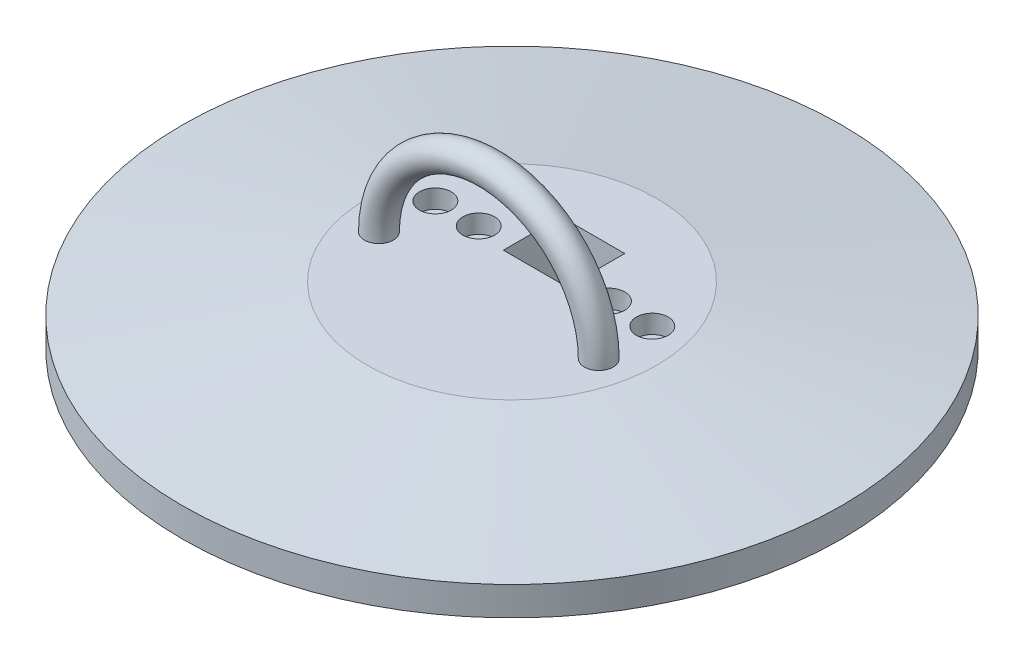
ISO-10303-21;
HEADER;
FILE_DESCRIPTION(('STEP AP214'),'2;1');
FILE_NAME('part.step','',(''),(''),'','','');
FILE_SCHEMA(('AUTOMOTIVE_DESIGN { 1 0 10303 214 1 1 1 1 }'));
ENDSEC;
DATA;
#1=APPLICATION_CONTEXT('core data for automotive mechanical design processes');
#2=APPLICATION_PROTOCOL_DEFINITION('international standard','automotive_design',2000,#1);
#3=PRODUCT_CONTEXT('',#1,'mechanical');
#4=PRODUCT('Part','Part','',(#3));
#5=PRODUCT_RELATED_PRODUCT_CATEGORY('part','',(#4));
#6=PRODUCT_DEFINITION_FORMATION('','',#4);
#7=PRODUCT_DEFINITION_CONTEXT('part definition',#1,'design');
#8=PRODUCT_DEFINITION('design','',#6,#7);
#9=PRODUCT_DEFINITION_SHAPE('','',#8);
#10=(LENGTH_UNIT() NAMED_UNIT(*) SI_UNIT(.MILLI.,.METRE.));
#11=(NAMED_UNIT(*) PLANE_ANGLE_UNIT() SI_UNIT($,.RADIAN.));
#12=(NAMED_UNIT(*) SI_UNIT($,.STERADIAN.) SOLID_ANGLE_UNIT());
#13=UNCERTAINTY_MEASURE_WITH_UNIT(LENGTH_MEASURE(1.E-05),#10,'distance_accuracy_value','');
#14=(GEOMETRIC_REPRESENTATION_CONTEXT(3) GLOBAL_UNCERTAINTY_ASSIGNED_CONTEXT((#13)) GLOBAL_UNIT_ASSIGNED_CONTEXT((#10,
#11,#12)) REPRESENTATION_CONTEXT('',''));
#15=CARTESIAN_POINT('',(0.,0.,0.));
#16=DIRECTION('',(0.,0.,1.));
#17=DIRECTION('',(1.,0.,0.));
#18=AXIS2_PLACEMENT_3D('',#15,#16,#17);
#19=CARTESIAN_POINT('',(0.,20.,0.));
#20=DIRECTION('',(0.,1.,0.));
#21=DIRECTION('',(0.,0.,1.));
#22=AXIS2_PLACEMENT_3D('',#19,#20,#21);
#23=PLANE('',#22);
#24=CARTESIAN_POINT('',(38.,20.,8.));
#25=DIRECTION('',(0.,1.,0.));
#26=DIRECTION('',(0.,0.,1.));
#27=AXIS2_PLACEMENT_3D('',#24,#25,#26);
#28=CIRCLE('',#27,5.);
#29=CARTESIAN_POINT('',(43.,20.,8.));
#30=VERTEX_POINT('',#29);
#31=EDGE_CURVE('E12',#30,#30,#28,.T.);
#32=ORIENTED_EDGE('',*,*,#31,.F.);
#33=EDGE_LOOP('',(#32));
#34=FACE_BOUND('',#33,.T.);
#35=CARTESIAN_POINT('',(37.5,20.,-11.));
#36=DIRECTION('',(0.,1.,0.));
#37=DIRECTION('',(0.,0.,1.));
#38=AXIS2_PLACEMENT_3D('',#35,#36,#37);
#39=CIRCLE('',#38,5.5);
#40=CARTESIAN_POINT('',(37.5,20.,-5.5));
#41=VERTEX_POINT('',#40);
#42=EDGE_CURVE('E150',#41,#41,#39,.T.);
#43=ORIENTED_EDGE('',*,*,#42,.F.);
#44=EDGE_LOOP('',(#43));
#45=FACE_BOUND('',#44,.T.);
#46=CARTESIAN_POINT('',(22.5,20.,-11.));
#47=DIRECTION('',(0.,1.,0.));
#48=DIRECTION('',(0.,0.,1.));
#49=AXIS2_PLACEMENT_3D('',#46,#47,#48);
#50=CIRCLE('',#49,5.5);
#51=CARTESIAN_POINT('',(22.5,20.,-5.5));
#52=VERTEX_POINT('',#51);
#53=EDGE_CURVE('E165',#52,#52,#50,.T.);
#54=ORIENTED_EDGE('',*,*,#53,.F.);
#55=EDGE_LOOP('',(#54));
#56=FACE_BOUND('',#55,.T.);
#57=CARTESIAN_POINT('',(-22.5,20.,-11.));
#58=DIRECTION('',(0.,1.,0.));
#59=DIRECTION('',(0.,0.,1.));
#60=AXIS2_PLACEMENT_3D('',#57,#58,#59);
#61=CIRCLE('',#60,5.5);
#62=CARTESIAN_POINT('',(-22.5,20.,-5.5));
#63=VERTEX_POINT('',#62);
#64=EDGE_CURVE('E177',#63,#63,#61,.T.);
#65=ORIENTED_EDGE('',*,*,#64,.F.);
#66=EDGE_LOOP('',(#65));
#67=FACE_BOUND('',#66,.T.);
#68=CARTESIAN_POINT('',(-37.5,20.,-11.));
#69=DIRECTION('',(0.,1.,0.));
#70=DIRECTION('',(0.,0.,1.));
#71=AXIS2_PLACEMENT_3D('',#68,#69,#70);
#72=CIRCLE('',#71,5.5);
#73=CARTESIAN_POINT('',(-37.5,20.,-5.5));
#74=VERTEX_POINT('',#73);
#75=EDGE_CURVE('E189',#74,#74,#72,.T.);
#76=ORIENTED_EDGE('',*,*,#75,.F.);
#77=EDGE_LOOP('',(#76));
#78=FACE_BOUND('',#77,.T.);
#79=DIRECTION('',(0.,0.,1.));
#80=VECTOR('',#79,1.);
#81=CARTESIAN_POINT('',(-11.,20.,-8.));
#82=LINE('',#81,#80);
#83=CARTESIAN_POINT('',(-11.,20.,-28.));
#84=VERTEX_POINT('',#83);
#85=CARTESIAN_POINT('',(-11.,20.,-8.));
#86=VERTEX_POINT('',#85);
#87=EDGE_CURVE('E201',#84,#86,#82,.T.);
#88=ORIENTED_EDGE('',*,*,#87,.F.);
#89=DIRECTION('',(-1.,0.,0.));
#90=VECTOR('',#89,1.);
#91=CARTESIAN_POINT('',(11.,20.,-28.));
#92=LINE('',#91,#90);
#93=CARTESIAN_POINT('',(11.,20.,-28.));
#94=VERTEX_POINT('',#93);
#95=EDGE_CURVE('E206',#94,#84,#92,.T.);
#96=ORIENTED_EDGE('',*,*,#95,.F.);
#97=DIRECTION('',(0.,0.,-1.));
#98=VECTOR('',#97,1.);
#99=CARTESIAN_POINT('',(11.,20.,-8.));
#100=LINE('',#99,#98);
#101=CARTESIAN_POINT('',(11.,20.,-8.));
#102=VERTEX_POINT('',#101);
#103=EDGE_CURVE('E219',#102,#94,#100,.T.);
#104=ORIENTED_EDGE('',*,*,#103,.F.);
#105=DIRECTION('',(1.,0.,0.));
#106=VECTOR('',#105,1.);
#107=CARTESIAN_POINT('',(11.,20.,-8.));
#108=LINE('',#107,#106);
#109=EDGE_CURVE('E216',#86,#102,#108,.T.);
#110=ORIENTED_EDGE('',*,*,#109,.F.);
#111=EDGE_LOOP('',(#88,#96,#104,#110));
#112=FACE_BOUND('',#111,.T.);
#113=CARTESIAN_POINT('',(0.,20.,0.));
#114=DIRECTION('',(0.,-1.,0.));
#115=DIRECTION('',(0.,0.,-1.));
#116=AXIS2_PLACEMENT_3D('',#113,#114,#115);
#117=CIRCLE('',#116,50.);
#118=CARTESIAN_POINT('',(0.,20.,-50.));
#119=VERTEX_POINT('',#118);
#120=EDGE_CURVE('E120',#119,#119,#117,.T.);
#121=ORIENTED_EDGE('',*,*,#120,.F.);
#122=EDGE_LOOP('',(#121));
#123=FACE_BOUND('',#122,.T.);
#124=CARTESIAN_POINT('',(-38.,20.,8.));
#125=DIRECTION('',(0.,-1.,0.));
#126=DIRECTION('',(0.,0.,1.));
#127=AXIS2_PLACEMENT_3D('',#124,#125,#126);
#128=CIRCLE('',#127,5.);
#129=CARTESIAN_POINT('',(-43.,20.,8.));
#130=VERTEX_POINT('',#129);
#131=EDGE_CURVE('E107',#130,#130,#128,.T.);
#132=ORIENTED_EDGE('',*,*,#131,.T.);
#133=EDGE_LOOP('',(#132));
#134=FACE_BOUND('',#133,.T.);
#135=ADVANCED_FACE('F34',(#34,#45,#56,#67,#78,#112,#123,#134),#23,.T.);
#136=CARTESIAN_POINT('',(0.,-15.,0.));
#137=DIRECTION('',(0.,1.,0.));
#138=DIRECTION('',(0.,0.,1.));
#139=AXIS2_PLACEMENT_3D('',#136,#137,#138);
#140=CYLINDRICAL_SURFACE('',#139,50.);
#141=DIRECTION('',(0.,-1.,0.));
#142=VECTOR('',#141,1.);
#143=CARTESIAN_POINT('',(37.5632799419859,77.025969646608,-33.));
#144=LINE('',#143,#142);
#145=CARTESIAN_POINT('',(37.5632799419859,0.,-33.));
#146=VERTEX_POINT('',#145);
#147=CARTESIAN_POINT('',(37.5632799419859,-15.,-33.));
#148=VERTEX_POINT('',#147);
#149=EDGE_CURVE('E51',#146,#148,#144,.T.);
#150=ORIENTED_EDGE('',*,*,#149,.F.);
#151=CARTESIAN_POINT('',(0.,0.,0.));
#152=DIRECTION('',(0.,-1.,0.));
#153=DIRECTION('',(0.,0.,-1.));
#154=AXIS2_PLACEMENT_3D('',#151,#152,#153);
#155=CIRCLE('',#154,50.);
#156=CARTESIAN_POINT('',(37.5632799419859,0.,33.));
#157=VERTEX_POINT('',#156);
#158=EDGE_CURVE('E128',#146,#157,#155,.T.);
#159=ORIENTED_EDGE('',*,*,#158,.T.);
#160=DIRECTION('',(0.,-1.,0.));
#161=VECTOR('',#160,1.);
#162=CARTESIAN_POINT('',(37.5632799419859,77.025969646608,33.));
#163=LINE('',#162,#161);
#164=CARTESIAN_POINT('',(37.5632799419859,-15.,33.));
#165=VERTEX_POINT('',#164);
#166=EDGE_CURVE('E142',#157,#165,#163,.T.);
#167=ORIENTED_EDGE('',*,*,#166,.T.);
#168=CARTESIAN_POINT('',(0.,-15.,0.));
#169=DIRECTION('',(0.,1.,0.));
#170=DIRECTION('',(0.,0.,1.));
#171=AXIS2_PLACEMENT_3D('',#168,#169,#170);
#172=CIRCLE('',#171,50.);
#173=EDGE_CURVE('E117',#165,#148,#172,.T.);
#174=ORIENTED_EDGE('',*,*,#173,.T.);
#175=EDGE_LOOP('',(#150,#159,#167,#174));
#176=FACE_BOUND('',#175,.T.);
#177=ADVANCED_FACE('F141',(#176),#140,.T.);
#178=CARTESIAN_POINT('',(0.,0.,0.));
#179=DIRECTION('',(0.,-1.,0.));
#180=DIRECTION('',(0.,0.,-1.));
#181=AXIS2_PLACEMENT_3D('',#178,#179,#180);
#182=PLANE('',#181);
#183=CARTESIAN_POINT('',(-37.5632799419868,0.,33.));
#184=VERTEX_POINT('',#183);
#185=CARTESIAN_POINT('',(-37.5632799419859,0.,-33.));
#186=VERTEX_POINT('',#185);
#187=EDGE_CURVE('E43',#184,#186,#155,.T.);
#188=ORIENTED_EDGE('',*,*,#187,.F.);
#189=DIRECTION('',(-1.,0.,0.));
#190=VECTOR('',#189,1.);
#191=CARTESIAN_POINT('',(0.,0.,33.));
#192=LINE('',#191,#190);
#193=EDGE_CURVE('E147',#157,#184,#192,.T.);
#194=ORIENTED_EDGE('',*,*,#193,.F.);
#195=ORIENTED_EDGE('',*,*,#158,.F.);
#196=DIRECTION('',(1.,0.,0.));
#197=VECTOR('',#196,1.);
#198=CARTESIAN_POINT('',(0.,0.,-33.));
#199=LINE('',#198,#197);
#200=EDGE_CURVE('E112',#186,#146,#199,.T.);
#201=ORIENTED_EDGE('',*,*,#200,.F.);
#202=EDGE_LOOP('',(#188,#194,#195,#201));
#203=FACE_BOUND('',#202,.T.);
#204=CARTESIAN_POINT('',(0.,0.,0.));
#205=DIRECTION('',(0.,-1.,0.));
#206=DIRECTION('',(0.,0.,-1.));
#207=AXIS2_PLACEMENT_3D('',#204,#205,#206);
#208=CIRCLE('',#207,114.);
#209=CARTESIAN_POINT('',(0.,0.,-114.));
#210=VERTEX_POINT('',#209);
#211=EDGE_CURVE('E38',#210,#210,#208,.T.);
#212=ORIENTED_EDGE('',*,*,#211,.T.);
#213=EDGE_LOOP('',(#212));
#214=FACE_BOUND('',#213,.T.);
#215=ADVANCED_FACE('F36',(#203,#214),#182,.T.);
#216=CARTESIAN_POINT('',(0.,0.,0.));
#217=DIRECTION('',(0.,-1.,0.));
#218=DIRECTION('',(0.,0.,-1.));
#219=AXIS2_PLACEMENT_3D('',#216,#217,#218);
#220=CYLINDRICAL_SURFACE('',#219,114.);
#221=CARTESIAN_POINT('',(0.,10.,0.));
#222=DIRECTION('',(0.,-1.,0.));
#223=DIRECTION('',(0.,0.,-1.));
#224=AXIS2_PLACEMENT_3D('',#221,#222,#223);
#225=CIRCLE('',#224,114.);
#226=CARTESIAN_POINT('',(0.,10.,-114.));
#227=VERTEX_POINT('',#226);
#228=EDGE_CURVE('E130',#227,#227,#225,.T.);
#229=ORIENTED_EDGE('',*,*,#228,.T.);
#230=EDGE_LOOP('',(#229));
#231=FACE_BOUND('',#230,.T.);
#232=ORIENTED_EDGE('',*,*,#211,.F.);
#233=EDGE_LOOP('',(#232));
#234=FACE_BOUND('',#233,.T.);
#235=ADVANCED_FACE('F267',(#231,#234),#220,.T.);
#236=CARTESIAN_POINT('',(0.,10.,0.));
#237=DIRECTION('',(0.,-1.,0.));
#238=DIRECTION('',(0.,0.,-1.));
#239=AXIS2_PLACEMENT_3D('',#236,#237,#238);
#240=CONICAL_SURFACE('',#239,114.,1.41579958487096);
#241=ORIENTED_EDGE('',*,*,#120,.T.);
#242=EDGE_LOOP('',(#241));
#243=FACE_BOUND('',#242,.T.);
#244=ORIENTED_EDGE('',*,*,#228,.F.);
#245=EDGE_LOOP('',(#244));
#246=FACE_BOUND('',#245,.T.);
#247=ADVANCED_FACE('F265',(#243,#246),#240,.T.);
#248=DIRECTION('',(0.,-1.,0.));
#249=VECTOR('',#248,1.);
#250=CARTESIAN_POINT('',(-37.5632799419859,77.025969646608,-33.));
#251=LINE('',#250,#249);
#252=CARTESIAN_POINT('',(-37.5632799419859,-15.,-33.));
#253=VERTEX_POINT('',#252);
#254=EDGE_CURVE('E102',#186,#253,#251,.T.);
#255=ORIENTED_EDGE('',*,*,#254,.T.);
#256=CARTESIAN_POINT('',(-37.5632799419859,-15.,33.));
#257=VERTEX_POINT('',#256);
#258=EDGE_CURVE('E59',#253,#257,#172,.T.);
#259=ORIENTED_EDGE('',*,*,#258,.T.);
#260=DIRECTION('',(0.,-1.,0.));
#261=VECTOR('',#260,1.);
#262=CARTESIAN_POINT('',(-37.5632799419868,77.025969646608,32.999999999999));
#263=LINE('',#262,#261);
#264=EDGE_CURVE('E148',#184,#257,#263,.T.);
#265=ORIENTED_EDGE('',*,*,#264,.F.);
#266=ORIENTED_EDGE('',*,*,#187,.T.);
#267=EDGE_LOOP('',(#255,#259,#265,#266));
#268=FACE_BOUND('',#267,.T.);
#269=ADVANCED_FACE('F110',(#268),#140,.T.);
#270=CARTESIAN_POINT('',(0.,-15.,0.));
#271=DIRECTION('',(0.,1.,0.));
#272=DIRECTION('',(0.,0.,1.));
#273=AXIS2_PLACEMENT_3D('',#270,#271,#272);
#274=PLANE('',#273);
#275=CARTESIAN_POINT('',(37.5,-15.,-11.));
#276=DIRECTION('',(0.,1.,0.));
#277=DIRECTION('',(0.,0.,1.));
#278=AXIS2_PLACEMENT_3D('',#275,#276,#277);
#279=CIRCLE('',#278,3.29999999999999);
#280=CARTESIAN_POINT('',(37.5,-15.,-7.70000000000001));
#281=VERTEX_POINT('',#280);
#282=EDGE_CURVE('E162',#281,#281,#279,.T.);
#283=ORIENTED_EDGE('',*,*,#282,.T.);
#284=EDGE_LOOP('',(#283));
#285=FACE_BOUND('',#284,.T.);
#286=CARTESIAN_POINT('',(22.5,-15.,-11.));
#287=DIRECTION('',(0.,1.,0.));
#288=DIRECTION('',(0.,0.,1.));
#289=AXIS2_PLACEMENT_3D('',#286,#287,#288);
#290=CIRCLE('',#289,3.29999999999999);
#291=CARTESIAN_POINT('',(22.5,-15.,-7.70000000000001));
#292=VERTEX_POINT('',#291);
#293=EDGE_CURVE('E174',#292,#292,#290,.T.);
#294=ORIENTED_EDGE('',*,*,#293,.T.);
#295=EDGE_LOOP('',(#294));
#296=FACE_BOUND('',#295,.T.);
#297=CARTESIAN_POINT('',(-22.5,-15.,-11.));
#298=DIRECTION('',(0.,1.,0.));
#299=DIRECTION('',(0.,0.,1.));
#300=AXIS2_PLACEMENT_3D('',#297,#298,#299);
#301=CIRCLE('',#300,3.29999999999999);
#302=CARTESIAN_POINT('',(-22.5,-15.,-7.70000000000001));
#303=VERTEX_POINT('',#302);
#304=EDGE_CURVE('E186',#303,#303,#301,.T.);
#305=ORIENTED_EDGE('',*,*,#304,.T.);
#306=EDGE_LOOP('',(#305));
#307=FACE_BOUND('',#306,.T.);
#308=CARTESIAN_POINT('',(-37.5,-15.,-11.));
#309=DIRECTION('',(0.,1.,0.));
#310=DIRECTION('',(0.,0.,1.));
#311=AXIS2_PLACEMENT_3D('',#308,#309,#310);
#312=CIRCLE('',#311,3.29999999999999);
#313=CARTESIAN_POINT('',(-37.5,-15.,-7.70000000000001));
#314=VERTEX_POINT('',#313);
#315=EDGE_CURVE('E198',#314,#314,#312,.T.);
#316=ORIENTED_EDGE('',*,*,#315,.T.);
#317=EDGE_LOOP('',(#316));
#318=FACE_BOUND('',#317,.T.);
#319=DIRECTION('',(-1.,0.,0.));
#320=VECTOR('',#319,1.);
#321=CARTESIAN_POINT('',(11.,-15.,-28.));
#322=LINE('',#321,#320);
#323=CARTESIAN_POINT('',(11.,-15.,-28.));
#324=VERTEX_POINT('',#323);
#325=CARTESIAN_POINT('',(-11.,-15.,-28.));
#326=VERTEX_POINT('',#325);
#327=EDGE_CURVE('E212',#324,#326,#322,.T.);
#328=ORIENTED_EDGE('',*,*,#327,.T.);
#329=DIRECTION('',(0.,0.,1.));
#330=VECTOR('',#329,1.);
#331=CARTESIAN_POINT('',(-11.,-15.,-8.));
#332=LINE('',#331,#330);
#333=CARTESIAN_POINT('',(-11.,-15.,-8.));
#334=VERTEX_POINT('',#333);
#335=EDGE_CURVE('E202',#326,#334,#332,.T.);
#336=ORIENTED_EDGE('',*,*,#335,.T.);
#337=DIRECTION('',(1.,0.,0.));
#338=VECTOR('',#337,1.);
#339=CARTESIAN_POINT('',(11.,-15.,-8.));
#340=LINE('',#339,#338);
#341=CARTESIAN_POINT('',(11.,-15.,-8.));
#342=VERTEX_POINT('',#341);
#343=EDGE_CURVE('E205',#334,#342,#340,.T.);
#344=ORIENTED_EDGE('',*,*,#343,.T.);
#345=DIRECTION('',(0.,0.,-1.));
#346=VECTOR('',#345,1.);
#347=CARTESIAN_POINT('',(11.,-15.,-8.));
#348=LINE('',#347,#346);
#349=EDGE_CURVE('E209',#342,#324,#348,.T.);
#350=ORIENTED_EDGE('',*,*,#349,.T.);
#351=EDGE_LOOP('',(#328,#336,#344,#350));
#352=FACE_BOUND('',#351,.T.);
#353=ORIENTED_EDGE('',*,*,#258,.F.);
#354=DIRECTION('',(-1.,0.,0.));
#355=VECTOR('',#354,1.);
#356=CARTESIAN_POINT('',(0.,-15.,-33.));
#357=LINE('',#356,#355);
#358=EDGE_CURVE('E100',#148,#253,#357,.T.);
#359=ORIENTED_EDGE('',*,*,#358,.F.);
#360=ORIENTED_EDGE('',*,*,#173,.F.);
#361=DIRECTION('',(1.,0.,0.));
#362=VECTOR('',#361,1.);
#363=CARTESIAN_POINT('',(0.,-15.,33.));
#364=LINE('',#363,#362);
#365=EDGE_CURVE('E116',#257,#165,#364,.T.);
#366=ORIENTED_EDGE('',*,*,#365,.F.);
#367=EDGE_LOOP('',(#353,#359,#360,#366));
#368=FACE_BOUND('',#367,.T.);
#369=ADVANCED_FACE('F115',(#285,#296,#307,#318,#352,#368),#274,.F.);
#370=CARTESIAN_POINT('',(-11.,-15.,-8.));
#371=DIRECTION('',(-1.,0.,0.));
#372=DIRECTION('',(0.,0.,1.));
#373=AXIS2_PLACEMENT_3D('',#370,#371,#372);
#374=PLANE('',#373);
#375=ORIENTED_EDGE('',*,*,#87,.T.);
#376=DIRECTION('',(0.,1.,0.));
#377=VECTOR('',#376,1.);
#378=CARTESIAN_POINT('',(-11.,-15.,-8.));
#379=LINE('',#378,#377);
#380=EDGE_CURVE('E125',#334,#86,#379,.T.);
#381=ORIENTED_EDGE('',*,*,#380,.F.);
#382=ORIENTED_EDGE('',*,*,#335,.F.);
#383=DIRECTION('',(0.,1.,0.));
#384=VECTOR('',#383,1.);
#385=CARTESIAN_POINT('',(-11.,-15.,-28.));
#386=LINE('',#385,#384);
#387=EDGE_CURVE('E118',#326,#84,#386,.T.);
#388=ORIENTED_EDGE('',*,*,#387,.T.);
#389=EDGE_LOOP('',(#375,#381,#382,#388));
#390=FACE_BOUND('',#389,.T.);
#391=ADVANCED_FACE('F244',(#390),#374,.F.);
#392=CARTESIAN_POINT('',(11.,-15.,-28.));
#393=DIRECTION('',(0.,0.,-1.));
#394=DIRECTION('',(-1.,0.,0.));
#395=AXIS2_PLACEMENT_3D('',#392,#393,#394);
#396=PLANE('',#395);
#397=ORIENTED_EDGE('',*,*,#95,.T.);
#398=ORIENTED_EDGE('',*,*,#387,.F.);
#399=ORIENTED_EDGE('',*,*,#327,.F.);
#400=DIRECTION('',(0.,1.,0.));
#401=VECTOR('',#400,1.);
#402=CARTESIAN_POINT('',(11.,-15.,-28.));
#403=LINE('',#402,#401);
#404=EDGE_CURVE('E121',#324,#94,#403,.T.);
#405=ORIENTED_EDGE('',*,*,#404,.T.);
#406=EDGE_LOOP('',(#397,#398,#399,#405));
#407=FACE_BOUND('',#406,.T.);
#408=ADVANCED_FACE('F242',(#407),#396,.F.);
#409=CARTESIAN_POINT('',(11.,-15.,-8.));
#410=DIRECTION('',(1.,0.,0.));
#411=DIRECTION('',(0.,0.,-1.));
#412=AXIS2_PLACEMENT_3D('',#409,#410,#411);
#413=PLANE('',#412);
#414=ORIENTED_EDGE('',*,*,#103,.T.);
#415=ORIENTED_EDGE('',*,*,#404,.F.);
#416=ORIENTED_EDGE('',*,*,#349,.F.);
#417=DIRECTION('',(0.,1.,0.));
#418=VECTOR('',#417,1.);
#419=CARTESIAN_POINT('',(11.,-15.,-8.));
#420=LINE('',#419,#418);
#421=EDGE_CURVE('E224',#342,#102,#420,.T.);
#422=ORIENTED_EDGE('',*,*,#421,.T.);
#423=EDGE_LOOP('',(#414,#415,#416,#422));
#424=FACE_BOUND('',#423,.T.);
#425=ADVANCED_FACE('F239',(#424),#413,.F.);
#426=CARTESIAN_POINT('',(11.,-15.,-8.));
#427=DIRECTION('',(0.,0.,1.));
#428=DIRECTION('',(1.,0.,0.));
#429=AXIS2_PLACEMENT_3D('',#426,#427,#428);
#430=PLANE('',#429);
#431=ORIENTED_EDGE('',*,*,#109,.T.);
#432=ORIENTED_EDGE('',*,*,#421,.F.);
#433=ORIENTED_EDGE('',*,*,#343,.F.);
#434=ORIENTED_EDGE('',*,*,#380,.T.);
#435=EDGE_LOOP('',(#431,#432,#433,#434));
#436=FACE_BOUND('',#435,.T.);
#437=ADVANCED_FACE('F231',(#436),#430,.F.);
#438=CARTESIAN_POINT('',(-37.5,20.,-11.));
#439=DIRECTION('',(0.,1.,0.));
#440=DIRECTION('',(0.,0.,1.));
#441=AXIS2_PLACEMENT_3D('',#438,#439,#440);
#442=CYLINDRICAL_SURFACE('',#441,3.29999999999999);
#443=ORIENTED_EDGE('',*,*,#315,.F.);
#444=EDGE_LOOP('',(#443));
#445=FACE_BOUND('',#444,.T.);
#446=CARTESIAN_POINT('',(-37.5,13.6,-11.));
#447=DIRECTION('',(0.,1.,0.));
#448=DIRECTION('',(0.,0.,1.));
#449=AXIS2_PLACEMENT_3D('',#446,#447,#448);
#450=CIRCLE('',#449,3.3);
#451=CARTESIAN_POINT('',(-37.5,13.6,-7.7));
#452=VERTEX_POINT('',#451);
#453=EDGE_CURVE('E195',#452,#452,#450,.T.);
#454=ORIENTED_EDGE('',*,*,#453,.T.);
#455=EDGE_LOOP('',(#454));
#456=FACE_BOUND('',#455,.T.);
#457=ADVANCED_FACE('F392',(#445,#456),#442,.F.);
#458=CARTESIAN_POINT('',(-34.2,13.6,-11.));
#459=DIRECTION('',(0.,-1.,0.));
#460=DIRECTION('',(0.,0.,-1.));
#461=AXIS2_PLACEMENT_3D('',#458,#459,#460);
#462=PLANE('',#461);
#463=ORIENTED_EDGE('',*,*,#453,.F.);
#464=EDGE_LOOP('',(#463));
#465=FACE_BOUND('',#464,.T.);
#466=CARTESIAN_POINT('',(-37.5,13.6,-11.));
#467=DIRECTION('',(0.,1.,0.));
#468=DIRECTION('',(0.,0.,1.));
#469=AXIS2_PLACEMENT_3D('',#466,#467,#468);
#470=CIRCLE('',#469,5.5);
#471=CARTESIAN_POINT('',(-37.5,13.6,-5.5));
#472=VERTEX_POINT('',#471);
#473=EDGE_CURVE('E192',#472,#472,#470,.T.);
#474=ORIENTED_EDGE('',*,*,#473,.T.);
#475=EDGE_LOOP('',(#474));
#476=FACE_BOUND('',#475,.T.);
#477=ADVANCED_FACE('F382',(#465,#476),#462,.F.);
#478=CARTESIAN_POINT('',(-37.5,20.,-11.));
#479=DIRECTION('',(0.,1.,0.));
#480=DIRECTION('',(0.,0.,1.));
#481=AXIS2_PLACEMENT_3D('',#478,#479,#480);
#482=CYLINDRICAL_SURFACE('',#481,5.5);
#483=ORIENTED_EDGE('',*,*,#473,.F.);
#484=EDGE_LOOP('',(#483));
#485=FACE_BOUND('',#484,.T.);
#486=ORIENTED_EDGE('',*,*,#75,.T.);
#487=EDGE_LOOP('',(#486));
#488=FACE_BOUND('',#487,.T.);
#489=ADVANCED_FACE('F372',(#485,#488),#482,.F.);
#490=CARTESIAN_POINT('',(-22.5,20.,-11.));
#491=DIRECTION('',(0.,1.,0.));
#492=DIRECTION('',(0.,0.,1.));
#493=AXIS2_PLACEMENT_3D('',#490,#491,#492);
#494=CYLINDRICAL_SURFACE('',#493,3.3);
#495=ORIENTED_EDGE('',*,*,#304,.F.);
#496=EDGE_LOOP('',(#495));
#497=FACE_BOUND('',#496,.T.);
#498=CARTESIAN_POINT('',(-22.5,13.6,-11.));
#499=DIRECTION('',(0.,1.,0.));
#500=DIRECTION('',(0.,0.,1.));
#501=AXIS2_PLACEMENT_3D('',#498,#499,#500);
#502=CIRCLE('',#501,3.3);
#503=CARTESIAN_POINT('',(-22.5,13.6,-7.7));
#504=VERTEX_POINT('',#503);
#505=EDGE_CURVE('E183',#504,#504,#502,.T.);
#506=ORIENTED_EDGE('',*,*,#505,.T.);
#507=EDGE_LOOP('',(#506));
#508=FACE_BOUND('',#507,.T.);
#509=ADVANCED_FACE('F362',(#497,#508),#494,.F.);
#510=CARTESIAN_POINT('',(-19.2,13.6,-11.));
#511=DIRECTION('',(0.,-1.,0.));
#512=DIRECTION('',(0.,0.,-1.));
#513=AXIS2_PLACEMENT_3D('',#510,#511,#512);
#514=PLANE('',#513);
#515=ORIENTED_EDGE('',*,*,#505,.F.);
#516=EDGE_LOOP('',(#515));
#517=FACE_BOUND('',#516,.T.);
#518=CARTESIAN_POINT('',(-22.5,13.6,-11.));
#519=DIRECTION('',(0.,1.,0.));
#520=DIRECTION('',(0.,0.,1.));
#521=AXIS2_PLACEMENT_3D('',#518,#519,#520);
#522=CIRCLE('',#521,5.5);
#523=CARTESIAN_POINT('',(-22.5,13.6,-5.5));
#524=VERTEX_POINT('',#523);
#525=EDGE_CURVE('E180',#524,#524,#522,.T.);
#526=ORIENTED_EDGE('',*,*,#525,.T.);
#527=EDGE_LOOP('',(#526));
#528=FACE_BOUND('',#527,.T.);
#529=ADVANCED_FACE('F352',(#517,#528),#514,.F.);
#530=CARTESIAN_POINT('',(-22.5,20.,-11.));
#531=DIRECTION('',(0.,1.,0.));
#532=DIRECTION('',(0.,0.,1.));
#533=AXIS2_PLACEMENT_3D('',#530,#531,#532);
#534=CYLINDRICAL_SURFACE('',#533,5.5);
#535=ORIENTED_EDGE('',*,*,#525,.F.);
#536=EDGE_LOOP('',(#535));
#537=FACE_BOUND('',#536,.T.);
#538=ORIENTED_EDGE('',*,*,#64,.T.);
#539=EDGE_LOOP('',(#538));
#540=FACE_BOUND('',#539,.T.);
#541=ADVANCED_FACE('F342',(#537,#540),#534,.F.);
#542=CARTESIAN_POINT('',(22.5,20.,-11.));
#543=DIRECTION('',(0.,1.,0.));
#544=DIRECTION('',(0.,0.,1.));
#545=AXIS2_PLACEMENT_3D('',#542,#543,#544);
#546=CYLINDRICAL_SURFACE('',#545,3.3);
#547=ORIENTED_EDGE('',*,*,#293,.F.);
#548=EDGE_LOOP('',(#547));
#549=FACE_BOUND('',#548,.T.);
#550=CARTESIAN_POINT('',(22.5,13.6,-11.));
#551=DIRECTION('',(0.,1.,0.));
#552=DIRECTION('',(0.,0.,1.));
#553=AXIS2_PLACEMENT_3D('',#550,#551,#552);
#554=CIRCLE('',#553,3.3);
#555=CARTESIAN_POINT('',(22.5,13.6,-7.7));
#556=VERTEX_POINT('',#555);
#557=EDGE_CURVE('E171',#556,#556,#554,.T.);
#558=ORIENTED_EDGE('',*,*,#557,.T.);
#559=EDGE_LOOP('',(#558));
#560=FACE_BOUND('',#559,.T.);
#561=ADVANCED_FACE('F332',(#549,#560),#546,.F.);
#562=CARTESIAN_POINT('',(25.8,13.6,-11.));
#563=DIRECTION('',(0.,-1.,0.));
#564=DIRECTION('',(0.,0.,-1.));
#565=AXIS2_PLACEMENT_3D('',#562,#563,#564);
#566=PLANE('',#565);
#567=ORIENTED_EDGE('',*,*,#557,.F.);
#568=EDGE_LOOP('',(#567));
#569=FACE_BOUND('',#568,.T.);
#570=CARTESIAN_POINT('',(22.5,13.6,-11.));
#571=DIRECTION('',(0.,1.,0.));
#572=DIRECTION('',(0.,0.,1.));
#573=AXIS2_PLACEMENT_3D('',#570,#571,#572);
#574=CIRCLE('',#573,5.5);
#575=CARTESIAN_POINT('',(22.5,13.6,-5.5));
#576=VERTEX_POINT('',#575);
#577=EDGE_CURVE('E168',#576,#576,#574,.T.);
#578=ORIENTED_EDGE('',*,*,#577,.T.);
#579=EDGE_LOOP('',(#578));
#580=FACE_BOUND('',#579,.T.);
#581=ADVANCED_FACE('F322',(#569,#580),#566,.F.);
#582=CARTESIAN_POINT('',(22.5,20.,-11.));
#583=DIRECTION('',(0.,1.,0.));
#584=DIRECTION('',(0.,0.,1.));
#585=AXIS2_PLACEMENT_3D('',#582,#583,#584);
#586=CYLINDRICAL_SURFACE('',#585,5.5);
#587=ORIENTED_EDGE('',*,*,#577,.F.);
#588=EDGE_LOOP('',(#587));
#589=FACE_BOUND('',#588,.T.);
#590=ORIENTED_EDGE('',*,*,#53,.T.);
#591=EDGE_LOOP('',(#590));
#592=FACE_BOUND('',#591,.T.);
#593=ADVANCED_FACE('F312',(#589,#592),#586,.F.);
#594=CARTESIAN_POINT('',(37.5,20.,-11.));
#595=DIRECTION('',(0.,1.,0.));
#596=DIRECTION('',(0.,0.,1.));
#597=AXIS2_PLACEMENT_3D('',#594,#595,#596);
#598=CYLINDRICAL_SURFACE('',#597,3.29999999999999);
#599=ORIENTED_EDGE('',*,*,#282,.F.);
#600=EDGE_LOOP('',(#599));
#601=FACE_BOUND('',#600,.T.);
#602=CARTESIAN_POINT('',(37.5,13.6,-11.));
#603=DIRECTION('',(0.,1.,0.));
#604=DIRECTION('',(0.,0.,1.));
#605=AXIS2_PLACEMENT_3D('',#602,#603,#604);
#606=CIRCLE('',#605,3.3);
#607=CARTESIAN_POINT('',(37.5,13.6,-7.7));
#608=VERTEX_POINT('',#607);
#609=EDGE_CURVE('E159',#608,#608,#606,.T.);
#610=ORIENTED_EDGE('',*,*,#609,.T.);
#611=EDGE_LOOP('',(#610));
#612=FACE_BOUND('',#611,.T.);
#613=ADVANCED_FACE('F302',(#601,#612),#598,.F.);
#614=CARTESIAN_POINT('',(40.8,13.6,-11.));
#615=DIRECTION('',(0.,-1.,0.));
#616=DIRECTION('',(0.,0.,-1.));
#617=AXIS2_PLACEMENT_3D('',#614,#615,#616);
#618=PLANE('',#617);
#619=ORIENTED_EDGE('',*,*,#609,.F.);
#620=EDGE_LOOP('',(#619));
#621=FACE_BOUND('',#620,.T.);
#622=CARTESIAN_POINT('',(37.5,13.6,-11.));
#623=DIRECTION('',(0.,1.,0.));
#624=DIRECTION('',(0.,0.,1.));
#625=AXIS2_PLACEMENT_3D('',#622,#623,#624);
#626=CIRCLE('',#625,5.5);
#627=CARTESIAN_POINT('',(37.5,13.6,-5.5));
#628=VERTEX_POINT('',#627);
#629=EDGE_CURVE('E153',#628,#628,#626,.T.);
#630=ORIENTED_EDGE('',*,*,#629,.T.);
#631=EDGE_LOOP('',(#630));
#632=FACE_BOUND('',#631,.T.);
#633=ADVANCED_FACE('F291',(#621,#632),#618,.F.);
#634=CARTESIAN_POINT('',(37.5,20.,-11.));
#635=DIRECTION('',(0.,1.,0.));
#636=DIRECTION('',(0.,0.,1.));
#637=AXIS2_PLACEMENT_3D('',#634,#635,#636);
#638=CYLINDRICAL_SURFACE('',#637,5.5);
#639=ORIENTED_EDGE('',*,*,#629,.F.);
#640=EDGE_LOOP('',(#639));
#641=FACE_BOUND('',#640,.T.);
#642=ORIENTED_EDGE('',*,*,#42,.T.);
#643=EDGE_LOOP('',(#642));
#644=FACE_BOUND('',#643,.T.);
#645=ADVANCED_FACE('F287',(#641,#644),#638,.F.);
#646=CARTESIAN_POINT('',(0.,77.025969646608,33.));
#647=DIRECTION('',(0.,0.,-1.));
#648=DIRECTION('',(-1.,0.,0.));
#649=AXIS2_PLACEMENT_3D('',#646,#647,#648);
#650=PLANE('',#649);
#651=ORIENTED_EDGE('',*,*,#193,.T.);
#652=ORIENTED_EDGE('',*,*,#264,.T.);
#653=ORIENTED_EDGE('',*,*,#365,.T.);
#654=ORIENTED_EDGE('',*,*,#166,.F.);
#655=EDGE_LOOP('',(#651,#652,#653,#654));
#656=FACE_BOUND('',#655,.T.);
#657=ADVANCED_FACE('F146',(#656),#650,.F.);
#658=CARTESIAN_POINT('',(0.,77.025969646608,-33.));
#659=DIRECTION('',(0.,0.,1.));
#660=DIRECTION('',(1.,0.,0.));
#661=AXIS2_PLACEMENT_3D('',#658,#659,#660);
#662=PLANE('',#661);
#663=ORIENTED_EDGE('',*,*,#200,.T.);
#664=ORIENTED_EDGE('',*,*,#149,.T.);
#665=ORIENTED_EDGE('',*,*,#358,.T.);
#666=ORIENTED_EDGE('',*,*,#254,.F.);
#667=EDGE_LOOP('',(#663,#664,#665,#666));
#668=FACE_BOUND('',#667,.T.);
#669=ADVANCED_FACE('F101',(#668),#662,.F.);
#670=CARTESIAN_POINT('',(0.,20.,8.));
#671=DIRECTION('',(0.,0.,1.));
#672=DIRECTION('',(1.,0.,0.));
#673=AXIS2_PLACEMENT_3D('',#670,#671,#672);
#674=TOROIDAL_SURFACE('',#673,38.,5.);
#675=CARTESIAN_POINT('',(0.,20.,8.));
#676=DIRECTION('',(0.,0.,1.));
#677=DIRECTION('',(1.,0.,0.));
#678=AXIS2_PLACEMENT_3D('',#675,#676,#677);
#679=CIRCLE('',#678,43.);
#680=EDGE_CURVE('',#30,#130,#679,.T.);
#681=ORIENTED_EDGE('',*,*,#31,.T.);
#682=ORIENTED_EDGE('',*,*,#131,.F.);
#683=ORIENTED_EDGE('',*,*,#680,.T.);
#684=ORIENTED_EDGE('',*,*,#680,.F.);
#685=EDGE_LOOP('',(#681,#683,#682,#684));
#686=FACE_BOUND('',#685,.T.);
#687=ADVANCED_FACE('F462',(#686),#674,.T.);
#688=CLOSED_SHELL('',(#135,#177,#215,#235,#247,#269,#369,#391,#408,#425,#437,#457,#477,#489,
#509,#529,#541,#561,#581,#593,#613,#633,#645,#657,#669,#687));
#689=MANIFOLD_SOLID_BREP('B2',#688);
#690=ADVANCED_BREP_SHAPE_REPRESENTATION('',(#18,#689),#14);
#691=SHAPE_DEFINITION_REPRESENTATION(#9,#690);
ENDSEC;
END-ISO-10303-21;
